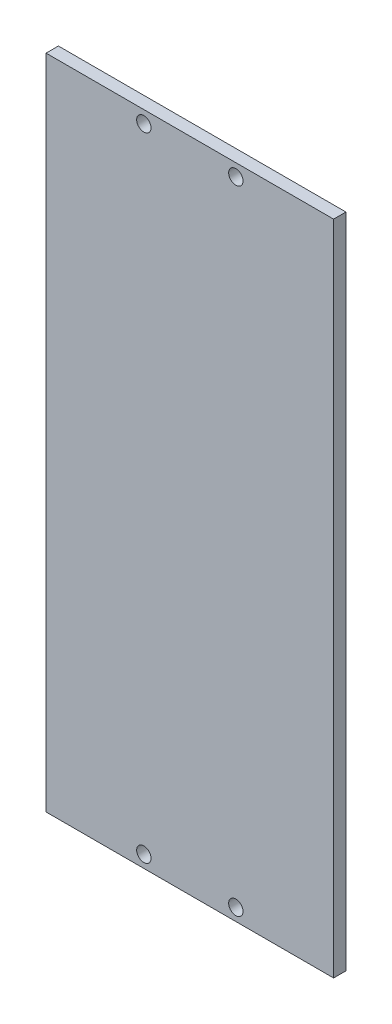
ISO-10303-21;
HEADER;
FILE_DESCRIPTION(('STEP AP214'),'2;1');
FILE_NAME('part.step','',(''),(''),'','','');
FILE_SCHEMA(('AUTOMOTIVE_DESIGN { 1 0 10303 214 1 1 1 1 }'));
ENDSEC;
DATA;
#1=APPLICATION_CONTEXT('core data for automotive mechanical design processes');
#2=APPLICATION_PROTOCOL_DEFINITION('international standard','automotive_design',2000,#1);
#3=PRODUCT_CONTEXT('',#1,'mechanical');
#4=PRODUCT('Part','Part','',(#3));
#5=PRODUCT_RELATED_PRODUCT_CATEGORY('part','',(#4));
#6=PRODUCT_DEFINITION_FORMATION('','',#4);
#7=PRODUCT_DEFINITION_CONTEXT('part definition',#1,'design');
#8=PRODUCT_DEFINITION('design','',#6,#7);
#9=PRODUCT_DEFINITION_SHAPE('','',#8);
#10=(LENGTH_UNIT() NAMED_UNIT(*) SI_UNIT(.MILLI.,.METRE.));
#11=(NAMED_UNIT(*) PLANE_ANGLE_UNIT() SI_UNIT($,.RADIAN.));
#12=(NAMED_UNIT(*) SI_UNIT($,.STERADIAN.) SOLID_ANGLE_UNIT());
#13=UNCERTAINTY_MEASURE_WITH_UNIT(LENGTH_MEASURE(1.E-05),#10,'distance_accuracy_value','');
#14=(GEOMETRIC_REPRESENTATION_CONTEXT(3) GLOBAL_UNCERTAINTY_ASSIGNED_CONTEXT((#13)) GLOBAL_UNIT_ASSIGNED_CONTEXT((#10,
#11,#12)) REPRESENTATION_CONTEXT('',''));
#15=CARTESIAN_POINT('',(0.,0.,0.));
#16=DIRECTION('',(0.,0.,1.));
#17=DIRECTION('',(1.,0.,0.));
#18=AXIS2_PLACEMENT_3D('',#15,#16,#17);
#19=CARTESIAN_POINT('',(0.,0.,3.));
#20=DIRECTION('',(0.,0.,1.));
#21=DIRECTION('',(1.,0.,0.));
#22=AXIS2_PLACEMENT_3D('',#19,#20,#21);
#23=PLANE('',#22);
#24=CARTESIAN_POINT('',(11.2,-77.,3.));
#25=DIRECTION('',(0.,0.,1.));
#26=DIRECTION('',(-1.,0.,0.));
#27=AXIS2_PLACEMENT_3D('',#24,#25,#26);
#28=CIRCLE('',#27,1.75);
#29=CARTESIAN_POINT('',(9.45000000000001,-77.,3.));
#30=VERTEX_POINT('',#29);
#31=EDGE_CURVE('E121',#30,#30,#28,.T.);
#32=ORIENTED_EDGE('',*,*,#31,.F.);
#33=EDGE_LOOP('',(#32));
#34=FACE_BOUND('',#33,.T.);
#35=CARTESIAN_POINT('',(-11.2,77.,3.));
#36=DIRECTION('',(0.,0.,1.));
#37=DIRECTION('',(1.,0.,0.));
#38=AXIS2_PLACEMENT_3D('',#35,#36,#37);
#39=CIRCLE('',#38,1.75);
#40=CARTESIAN_POINT('',(-9.45,77.,3.));
#41=VERTEX_POINT('',#40);
#42=EDGE_CURVE('E100',#41,#41,#39,.T.);
#43=ORIENTED_EDGE('',*,*,#42,.F.);
#44=EDGE_LOOP('',(#43));
#45=FACE_BOUND('',#44,.T.);
#46=DIRECTION('',(0.,-1.,0.));
#47=VECTOR('',#46,1.);
#48=CARTESIAN_POINT('',(-35.,-80.,3.));
#49=LINE('',#48,#47);
#50=CARTESIAN_POINT('',(-35.,80.,3.));
#51=VERTEX_POINT('',#50);
#52=CARTESIAN_POINT('',(-35.,-80.,3.));
#53=VERTEX_POINT('',#52);
#54=EDGE_CURVE('E85',#51,#53,#49,.T.);
#55=ORIENTED_EDGE('',*,*,#54,.T.);
#56=DIRECTION('',(1.,0.,0.));
#57=VECTOR('',#56,1.);
#58=CARTESIAN_POINT('',(35.,-80.,3.));
#59=LINE('',#58,#57);
#60=CARTESIAN_POINT('',(35.,-80.,3.));
#61=VERTEX_POINT('',#60);
#62=EDGE_CURVE('E80',#53,#61,#59,.T.);
#63=ORIENTED_EDGE('',*,*,#62,.T.);
#64=DIRECTION('',(0.,1.,0.));
#65=VECTOR('',#64,1.);
#66=CARTESIAN_POINT('',(35.,-80.,3.));
#67=LINE('',#66,#65);
#68=CARTESIAN_POINT('',(35.,80.,3.));
#69=VERTEX_POINT('',#68);
#70=EDGE_CURVE('E83',#61,#69,#67,.T.);
#71=ORIENTED_EDGE('',*,*,#70,.T.);
#72=DIRECTION('',(-1.,0.,0.));
#73=VECTOR('',#72,1.);
#74=CARTESIAN_POINT('',(35.,80.,3.));
#75=LINE('',#74,#73);
#76=EDGE_CURVE('E50',#69,#51,#75,.T.);
#77=ORIENTED_EDGE('',*,*,#76,.T.);
#78=EDGE_LOOP('',(#55,#63,#71,#77));
#79=FACE_BOUND('',#78,.T.);
#80=CARTESIAN_POINT('',(11.2,77.,3.));
#81=DIRECTION('',(0.,0.,1.));
#82=DIRECTION('',(1.,0.,0.));
#83=AXIS2_PLACEMENT_3D('',#80,#81,#82);
#84=CIRCLE('',#83,1.75);
#85=CARTESIAN_POINT('',(12.95,77.,3.));
#86=VERTEX_POINT('',#85);
#87=EDGE_CURVE('E115',#86,#86,#84,.T.);
#88=ORIENTED_EDGE('',*,*,#87,.F.);
#89=EDGE_LOOP('',(#88));
#90=FACE_BOUND('',#89,.T.);
#91=CARTESIAN_POINT('',(-11.2,-77.,3.));
#92=DIRECTION('',(0.,0.,1.));
#93=DIRECTION('',(-1.,0.,0.));
#94=AXIS2_PLACEMENT_3D('',#91,#92,#93);
#95=CIRCLE('',#94,1.75);
#96=CARTESIAN_POINT('',(-12.95,-77.,3.));
#97=VERTEX_POINT('',#96);
#98=EDGE_CURVE('E127',#97,#97,#95,.T.);
#99=ORIENTED_EDGE('',*,*,#98,.F.);
#100=EDGE_LOOP('',(#99));
#101=FACE_BOUND('',#100,.T.);
#102=ADVANCED_FACE('F33',(#34,#45,#79,#90,#101),#23,.T.);
#103=CARTESIAN_POINT('',(0.,0.,0.));
#104=DIRECTION('',(0.,0.,1.));
#105=DIRECTION('',(1.,0.,0.));
#106=AXIS2_PLACEMENT_3D('',#103,#104,#105);
#107=PLANE('',#106);
#108=DIRECTION('',(0.,-1.,0.));
#109=VECTOR('',#108,1.);
#110=CARTESIAN_POINT('',(-35.,-80.,0.));
#111=LINE('',#110,#109);
#112=CARTESIAN_POINT('',(-35.,80.,0.));
#113=VERTEX_POINT('',#112);
#114=CARTESIAN_POINT('',(-35.,-80.,0.));
#115=VERTEX_POINT('',#114);
#116=EDGE_CURVE('E97',#113,#115,#111,.T.);
#117=ORIENTED_EDGE('',*,*,#116,.F.);
#118=DIRECTION('',(-1.,0.,0.));
#119=VECTOR('',#118,1.);
#120=CARTESIAN_POINT('',(35.,80.,0.));
#121=LINE('',#120,#119);
#122=CARTESIAN_POINT('',(35.,80.,0.));
#123=VERTEX_POINT('',#122);
#124=EDGE_CURVE('E73',#123,#113,#121,.T.);
#125=ORIENTED_EDGE('',*,*,#124,.F.);
#126=DIRECTION('',(0.,1.,0.));
#127=VECTOR('',#126,1.);
#128=CARTESIAN_POINT('',(35.,-80.,0.));
#129=LINE('',#128,#127);
#130=CARTESIAN_POINT('',(35.,-80.,0.));
#131=VERTEX_POINT('',#130);
#132=EDGE_CURVE('E67',#131,#123,#129,.T.);
#133=ORIENTED_EDGE('',*,*,#132,.F.);
#134=DIRECTION('',(1.,0.,0.));
#135=VECTOR('',#134,1.);
#136=CARTESIAN_POINT('',(35.,-80.,0.));
#137=LINE('',#136,#135);
#138=EDGE_CURVE('E89',#115,#131,#137,.T.);
#139=ORIENTED_EDGE('',*,*,#138,.F.);
#140=EDGE_LOOP('',(#117,#125,#133,#139));
#141=FACE_BOUND('',#140,.T.);
#142=CARTESIAN_POINT('',(-11.2,77.,0.));
#143=DIRECTION('',(0.,0.,1.));
#144=DIRECTION('',(1.,0.,0.));
#145=AXIS2_PLACEMENT_3D('',#142,#143,#144);
#146=CIRCLE('',#145,1.75);
#147=CARTESIAN_POINT('',(-9.45,77.,0.));
#148=VERTEX_POINT('',#147);
#149=EDGE_CURVE('E112',#148,#148,#146,.T.);
#150=ORIENTED_EDGE('',*,*,#149,.T.);
#151=EDGE_LOOP('',(#150));
#152=FACE_BOUND('',#151,.T.);
#153=CARTESIAN_POINT('',(11.2,77.,0.));
#154=DIRECTION('',(0.,0.,1.));
#155=DIRECTION('',(1.,0.,0.));
#156=AXIS2_PLACEMENT_3D('',#153,#154,#155);
#157=CIRCLE('',#156,1.75);
#158=CARTESIAN_POINT('',(12.95,77.,0.));
#159=VERTEX_POINT('',#158);
#160=EDGE_CURVE('E118',#159,#159,#157,.T.);
#161=ORIENTED_EDGE('',*,*,#160,.T.);
#162=EDGE_LOOP('',(#161));
#163=FACE_BOUND('',#162,.T.);
#164=CARTESIAN_POINT('',(11.2,-77.,0.));
#165=DIRECTION('',(0.,0.,1.));
#166=DIRECTION('',(-1.,0.,0.));
#167=AXIS2_PLACEMENT_3D('',#164,#165,#166);
#168=CIRCLE('',#167,1.75);
#169=CARTESIAN_POINT('',(9.45000000000001,-77.,0.));
#170=VERTEX_POINT('',#169);
#171=EDGE_CURVE('E124',#170,#170,#168,.T.);
#172=ORIENTED_EDGE('',*,*,#171,.T.);
#173=EDGE_LOOP('',(#172));
#174=FACE_BOUND('',#173,.T.);
#175=CARTESIAN_POINT('',(-11.2,-77.,0.));
#176=DIRECTION('',(0.,0.,1.));
#177=DIRECTION('',(-1.,0.,0.));
#178=AXIS2_PLACEMENT_3D('',#175,#176,#177);
#179=CIRCLE('',#178,1.75);
#180=CARTESIAN_POINT('',(-12.95,-77.,0.));
#181=VERTEX_POINT('',#180);
#182=EDGE_CURVE('E130',#181,#181,#179,.T.);
#183=ORIENTED_EDGE('',*,*,#182,.T.);
#184=EDGE_LOOP('',(#183));
#185=FACE_BOUND('',#184,.T.);
#186=ADVANCED_FACE('F108',(#141,#152,#163,#174,#185),#107,.F.);
#187=CARTESIAN_POINT('',(-35.,-80.,3.));
#188=DIRECTION('',(1.,0.,0.));
#189=DIRECTION('',(0.,0.,-1.));
#190=AXIS2_PLACEMENT_3D('',#187,#188,#189);
#191=PLANE('',#190);
#192=ORIENTED_EDGE('',*,*,#116,.T.);
#193=DIRECTION('',(0.,0.,-1.));
#194=VECTOR('',#193,1.);
#195=CARTESIAN_POINT('',(-35.,-80.,3.));
#196=LINE('',#195,#194);
#197=EDGE_CURVE('E11',#53,#115,#196,.T.);
#198=ORIENTED_EDGE('',*,*,#197,.F.);
#199=ORIENTED_EDGE('',*,*,#54,.F.);
#200=DIRECTION('',(0.,0.,-1.));
#201=VECTOR('',#200,1.);
#202=CARTESIAN_POINT('',(-35.,80.,3.));
#203=LINE('',#202,#201);
#204=EDGE_CURVE('E93',#51,#113,#203,.T.);
#205=ORIENTED_EDGE('',*,*,#204,.T.);
#206=EDGE_LOOP('',(#192,#198,#199,#205));
#207=FACE_BOUND('',#206,.T.);
#208=ADVANCED_FACE('F35',(#207),#191,.F.);
#209=CARTESIAN_POINT('',(35.,-80.,3.));
#210=DIRECTION('',(0.,1.,0.));
#211=DIRECTION('',(-1.,0.,0.));
#212=AXIS2_PLACEMENT_3D('',#209,#210,#211);
#213=PLANE('',#212);
#214=ORIENTED_EDGE('',*,*,#138,.T.);
#215=DIRECTION('',(0.,0.,-1.));
#216=VECTOR('',#215,1.);
#217=CARTESIAN_POINT('',(35.,-80.,3.));
#218=LINE('',#217,#216);
#219=EDGE_CURVE('E42',#61,#131,#218,.T.);
#220=ORIENTED_EDGE('',*,*,#219,.F.);
#221=ORIENTED_EDGE('',*,*,#62,.F.);
#222=ORIENTED_EDGE('',*,*,#197,.T.);
#223=EDGE_LOOP('',(#214,#220,#221,#222));
#224=FACE_BOUND('',#223,.T.);
#225=ADVANCED_FACE('F88',(#224),#213,.F.);
#226=CARTESIAN_POINT('',(35.,-80.,3.));
#227=DIRECTION('',(-1.,0.,0.));
#228=DIRECTION('',(0.,0.,1.));
#229=AXIS2_PLACEMENT_3D('',#226,#227,#228);
#230=PLANE('',#229);
#231=ORIENTED_EDGE('',*,*,#132,.T.);
#232=DIRECTION('',(0.,0.,-1.));
#233=VECTOR('',#232,1.);
#234=CARTESIAN_POINT('',(35.,80.,3.));
#235=LINE('',#234,#233);
#236=EDGE_CURVE('E90',#69,#123,#235,.T.);
#237=ORIENTED_EDGE('',*,*,#236,.F.);
#238=ORIENTED_EDGE('',*,*,#70,.F.);
#239=ORIENTED_EDGE('',*,*,#219,.T.);
#240=EDGE_LOOP('',(#231,#237,#238,#239));
#241=FACE_BOUND('',#240,.T.);
#242=ADVANCED_FACE('F91',(#241),#230,.F.);
#243=CARTESIAN_POINT('',(35.,80.,3.));
#244=DIRECTION('',(0.,-1.,0.));
#245=DIRECTION('',(1.,0.,0.));
#246=AXIS2_PLACEMENT_3D('',#243,#244,#245);
#247=PLANE('',#246);
#248=ORIENTED_EDGE('',*,*,#124,.T.);
#249=ORIENTED_EDGE('',*,*,#204,.F.);
#250=ORIENTED_EDGE('',*,*,#76,.F.);
#251=ORIENTED_EDGE('',*,*,#236,.T.);
#252=EDGE_LOOP('',(#248,#249,#250,#251));
#253=FACE_BOUND('',#252,.T.);
#254=ADVANCED_FACE('F105',(#253),#247,.F.);
#255=CARTESIAN_POINT('',(-11.2,77.,3.));
#256=DIRECTION('',(0.,0.,-1.));
#257=DIRECTION('',(-1.,0.,0.));
#258=AXIS2_PLACEMENT_3D('',#255,#256,#257);
#259=CYLINDRICAL_SURFACE('',#258,1.75);
#260=ORIENTED_EDGE('',*,*,#42,.T.);
#261=EDGE_LOOP('',(#260));
#262=FACE_BOUND('',#261,.T.);
#263=ORIENTED_EDGE('',*,*,#149,.F.);
#264=EDGE_LOOP('',(#263));
#265=FACE_BOUND('',#264,.T.);
#266=ADVANCED_FACE('F149',(#262,#265),#259,.F.);
#267=CARTESIAN_POINT('',(11.2,77.,3.));
#268=DIRECTION('',(0.,0.,-1.));
#269=DIRECTION('',(-1.,0.,0.));
#270=AXIS2_PLACEMENT_3D('',#267,#268,#269);
#271=CYLINDRICAL_SURFACE('',#270,1.75);
#272=ORIENTED_EDGE('',*,*,#87,.T.);
#273=EDGE_LOOP('',(#272));
#274=FACE_BOUND('',#273,.T.);
#275=ORIENTED_EDGE('',*,*,#160,.F.);
#276=EDGE_LOOP('',(#275));
#277=FACE_BOUND('',#276,.T.);
#278=ADVANCED_FACE('F195',(#274,#277),#271,.F.);
#279=CARTESIAN_POINT('',(11.2,-77.,3.));
#280=DIRECTION('',(0.,0.,-1.));
#281=DIRECTION('',(-1.,0.,0.));
#282=AXIS2_PLACEMENT_3D('',#279,#280,#281);
#283=CYLINDRICAL_SURFACE('',#282,1.75);
#284=ORIENTED_EDGE('',*,*,#31,.T.);
#285=EDGE_LOOP('',(#284));
#286=FACE_BOUND('',#285,.T.);
#287=ORIENTED_EDGE('',*,*,#171,.F.);
#288=EDGE_LOOP('',(#287));
#289=FACE_BOUND('',#288,.T.);
#290=ADVANCED_FACE('F203',(#286,#289),#283,.F.);
#291=CARTESIAN_POINT('',(-11.2,-77.,3.));
#292=DIRECTION('',(0.,0.,-1.));
#293=DIRECTION('',(-1.,0.,0.));
#294=AXIS2_PLACEMENT_3D('',#291,#292,#293);
#295=CYLINDRICAL_SURFACE('',#294,1.75);
#296=ORIENTED_EDGE('',*,*,#98,.T.);
#297=EDGE_LOOP('',(#296));
#298=FACE_BOUND('',#297,.T.);
#299=ORIENTED_EDGE('',*,*,#182,.F.);
#300=EDGE_LOOP('',(#299));
#301=FACE_BOUND('',#300,.T.);
#302=ADVANCED_FACE('F136',(#298,#301),#295,.F.);
#303=CLOSED_SHELL('',(#102,#186,#208,#225,#242,#254,#266,#278,#290,#302));
#304=MANIFOLD_SOLID_BREP('B2',#303);
#305=ADVANCED_BREP_SHAPE_REPRESENTATION('',(#18,#304),#14);
#306=SHAPE_DEFINITION_REPRESENTATION(#9,#305);
ENDSEC;
END-ISO-10303-21;
